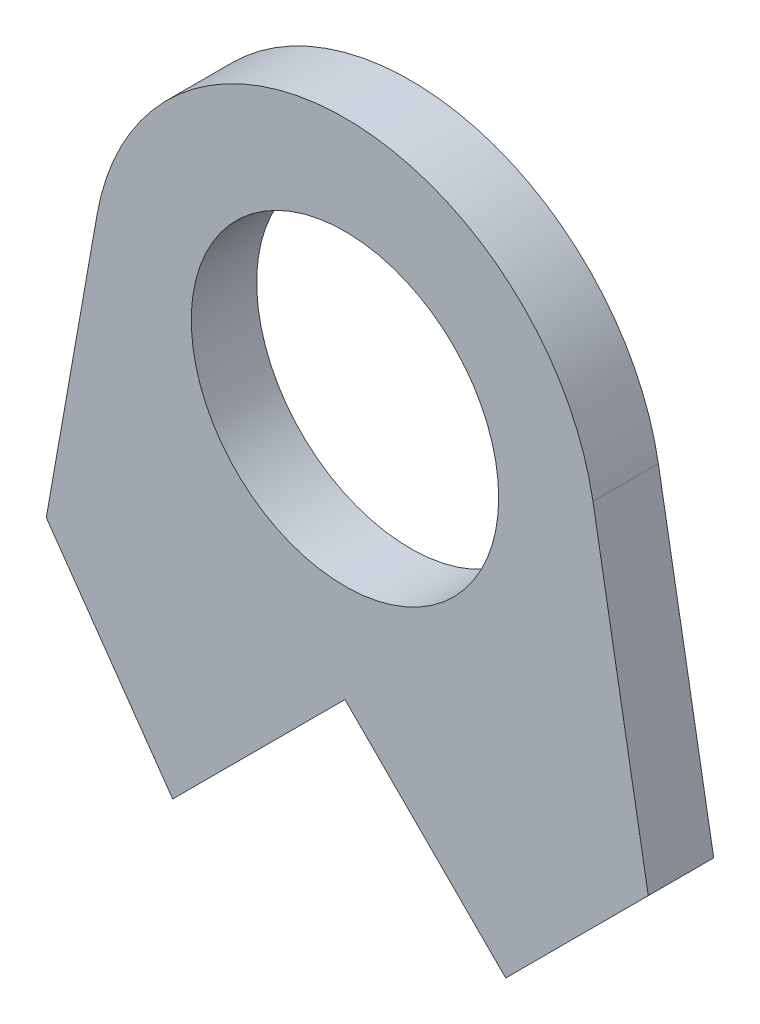
ISO-10303-21;
HEADER;
FILE_DESCRIPTION(('STEP AP214'),'2;1');
FILE_NAME('part.step','',(''),(''),'','','');
FILE_SCHEMA(('AUTOMOTIVE_DESIGN { 1 0 10303 214 1 1 1 1 }'));
ENDSEC;
DATA;
#1=APPLICATION_CONTEXT('core data for automotive mechanical design processes');
#2=APPLICATION_PROTOCOL_DEFINITION('international standard','automotive_design',2000,#1);
#3=PRODUCT_CONTEXT('',#1,'mechanical');
#4=PRODUCT('Part','Part','',(#3));
#5=PRODUCT_RELATED_PRODUCT_CATEGORY('part','',(#4));
#6=PRODUCT_DEFINITION_FORMATION('','',#4);
#7=PRODUCT_DEFINITION_CONTEXT('part definition',#1,'design');
#8=PRODUCT_DEFINITION('design','',#6,#7);
#9=PRODUCT_DEFINITION_SHAPE('','',#8);
#10=(LENGTH_UNIT() NAMED_UNIT(*) SI_UNIT(.MILLI.,.METRE.));
#11=(NAMED_UNIT(*) PLANE_ANGLE_UNIT() SI_UNIT($,.RADIAN.));
#12=(NAMED_UNIT(*) SI_UNIT($,.STERADIAN.) SOLID_ANGLE_UNIT());
#13=UNCERTAINTY_MEASURE_WITH_UNIT(LENGTH_MEASURE(1.E-05),#10,'distance_accuracy_value','');
#14=(GEOMETRIC_REPRESENTATION_CONTEXT(3) GLOBAL_UNCERTAINTY_ASSIGNED_CONTEXT((#13)) GLOBAL_UNIT_ASSIGNED_CONTEXT((#10,
#11,#12)) REPRESENTATION_CONTEXT('',''));
#15=CARTESIAN_POINT('',(0.,0.,0.));
#16=DIRECTION('',(0.,0.,1.));
#17=DIRECTION('',(1.,0.,0.));
#18=AXIS2_PLACEMENT_3D('',#15,#16,#17);
#19=CARTESIAN_POINT('',(85.,265.346291066469,10.));
#20=DIRECTION('',(0.,0.,-1.));
#21=DIRECTION('',(-1.,0.,0.));
#22=AXIS2_PLACEMENT_3D('',#19,#20,#21);
#23=PLANE('',#22);
#24=DIRECTION('',(-0.173648177666935,-0.984807753012207,0.));
#25=VECTOR('',#24,1.);
#26=CARTESIAN_POINT('',(47.08490150903,272.031745906646,10.));
#27=LINE('',#26,#25);
#28=CARTESIAN_POINT('',(47.08490150903,272.031745906646,10.));
#29=VERTEX_POINT('',#28);
#30=CARTESIAN_POINT('',(39.3396518645264,228.106252409373,10.));
#31=VERTEX_POINT('',#30);
#32=EDGE_CURVE('E116',#29,#31,#27,.T.);
#33=ORIENTED_EDGE('',*,*,#32,.T.);
#34=DIRECTION('',(-0.573576436351047,0.819152044288991,0.));
#35=VECTOR('',#34,1.);
#36=CARTESIAN_POINT('',(60.026746234922,198.562019819007,10.));
#37=LINE('',#36,#35);
#38=CARTESIAN_POINT('',(58.6631483516009,200.509439418069,10.));
#39=VERTEX_POINT('',#38);
#40=EDGE_CURVE('E147',#31,#39,#37,.F.);
#41=ORIENTED_EDGE('',*,*,#40,.T.);
#42=DIRECTION('',(0.707106781186547,0.707106781186548,0.));
#43=VECTOR('',#42,1.);
#44=CARTESIAN_POINT('',(85.,226.846291066469,10.));
#45=LINE('',#44,#43);
#46=CARTESIAN_POINT('',(85.,226.846291066469,10.));
#47=VERTEX_POINT('',#46);
#48=EDGE_CURVE('E118',#39,#47,#45,.T.);
#49=ORIENTED_EDGE('',*,*,#48,.T.);
#50=DIRECTION('',(0.707106781186549,-0.707106781186546,0.));
#51=VECTOR('',#50,1.);
#52=CARTESIAN_POINT('',(85.,226.846291066469,10.));
#53=LINE('',#52,#51);
#54=CARTESIAN_POINT('',(109.577032356472,202.269258709997,10.));
#55=VERTEX_POINT('',#54);
#56=EDGE_CURVE('E101',#47,#55,#53,.T.);
#57=ORIENTED_EDGE('',*,*,#56,.T.);
#58=DIRECTION('',(-0.707106781186544,-0.707106781186551,0.));
#59=VECTOR('',#58,1.);
#60=CARTESIAN_POINT('',(131.372906538627,224.065132892153,10.));
#61=LINE('',#60,#59);
#62=CARTESIAN_POINT('',(131.372906538627,224.065132892153,10.));
#63=VERTEX_POINT('',#62);
#64=EDGE_CURVE('E50',#55,#63,#61,.F.);
#65=ORIENTED_EDGE('',*,*,#64,.T.);
#66=DIRECTION('',(-0.173648177666935,0.984807753012207,0.));
#67=VECTOR('',#66,1.);
#68=CARTESIAN_POINT('',(122.91509849097,272.031745906646,10.));
#69=LINE('',#68,#67);
#70=CARTESIAN_POINT('',(122.91509849097,272.031745906646,10.));
#71=VERTEX_POINT('',#70);
#72=EDGE_CURVE('E91',#63,#71,#69,.T.);
#73=ORIENTED_EDGE('',*,*,#72,.T.);
#74=CARTESIAN_POINT('',(85.,265.346291066469,10.));
#75=DIRECTION('',(0.,0.,1.));
#76=DIRECTION('',(-1.,0.,0.));
#77=AXIS2_PLACEMENT_3D('',#74,#75,#76);
#78=CIRCLE('',#77,38.5);
#79=EDGE_CURVE('E96',#71,#29,#78,.T.);
#80=ORIENTED_EDGE('',*,*,#79,.T.);
#81=EDGE_LOOP('',(#33,#41,#49,#57,#65,#73,#80));
#82=FACE_BOUND('',#81,.T.);
#83=CARTESIAN_POINT('',(85.,265.346291066469,10.));
#84=DIRECTION('',(0.,0.,1.));
#85=DIRECTION('',(1.,0.,0.));
#86=AXIS2_PLACEMENT_3D('',#83,#84,#85);
#87=CIRCLE('',#86,23.4999999999999);
#88=CARTESIAN_POINT('',(108.5,265.346291066469,10.));
#89=VERTEX_POINT('',#88);
#90=EDGE_CURVE('E126',#89,#89,#87,.T.);
#91=ORIENTED_EDGE('',*,*,#90,.F.);
#92=EDGE_LOOP('',(#91));
#93=FACE_BOUND('',#92,.T.);
#94=ADVANCED_FACE('F35',(#82,#93),#23,.F.);
#95=CARTESIAN_POINT('',(85.,265.346291066469,0.));
#96=DIRECTION('',(0.,0.,-1.));
#97=DIRECTION('',(-1.,0.,0.));
#98=AXIS2_PLACEMENT_3D('',#95,#96,#97);
#99=PLANE('',#98);
#100=DIRECTION('',(0.707106781186547,0.707106781186548,0.));
#101=VECTOR('',#100,1.);
#102=CARTESIAN_POINT('',(85.,226.846291066469,0.));
#103=LINE('',#102,#101);
#104=CARTESIAN_POINT('',(58.6631483516009,200.509439418069,0.));
#105=VERTEX_POINT('',#104);
#106=CARTESIAN_POINT('',(85.,226.846291066469,0.));
#107=VERTEX_POINT('',#106);
#108=EDGE_CURVE('E133',#105,#107,#103,.T.);
#109=ORIENTED_EDGE('',*,*,#108,.F.);
#110=DIRECTION('',(0.573576436351047,-0.819152044288991,0.));
#111=VECTOR('',#110,1.);
#112=CARTESIAN_POINT('',(36.8643517635386,231.641347314687,0.));
#113=LINE('',#112,#111);
#114=CARTESIAN_POINT('',(39.3396518645264,228.106252409373,0.));
#115=VERTEX_POINT('',#114);
#116=EDGE_CURVE('E141',#105,#115,#113,.F.);
#117=ORIENTED_EDGE('',*,*,#116,.T.);
#118=DIRECTION('',(-0.173648177666935,-0.984807753012207,0.));
#119=VECTOR('',#118,1.);
#120=CARTESIAN_POINT('',(47.08490150903,272.031745906646,0.));
#121=LINE('',#120,#119);
#122=CARTESIAN_POINT('',(47.08490150903,272.031745906646,0.));
#123=VERTEX_POINT('',#122);
#124=EDGE_CURVE('E130',#123,#115,#121,.T.);
#125=ORIENTED_EDGE('',*,*,#124,.F.);
#126=CARTESIAN_POINT('',(85.,265.346291066469,0.));
#127=DIRECTION('',(0.,0.,1.));
#128=DIRECTION('',(-1.,0.,0.));
#129=AXIS2_PLACEMENT_3D('',#126,#127,#128);
#130=CIRCLE('',#129,38.5);
#131=CARTESIAN_POINT('',(122.91509849097,272.031745906646,0.));
#132=VERTEX_POINT('',#131);
#133=EDGE_CURVE('E128',#132,#123,#130,.T.);
#134=ORIENTED_EDGE('',*,*,#133,.F.);
#135=DIRECTION('',(-0.173648177666935,0.984807753012207,0.));
#136=VECTOR('',#135,1.);
#137=CARTESIAN_POINT('',(122.91509849097,272.031745906646,0.));
#138=LINE('',#137,#136);
#139=CARTESIAN_POINT('',(131.372906538627,224.065132892153,0.));
#140=VERTEX_POINT('',#139);
#141=EDGE_CURVE('E107',#140,#132,#138,.T.);
#142=ORIENTED_EDGE('',*,*,#141,.F.);
#143=DIRECTION('',(0.707106781186544,0.707106781186551,0.));
#144=VECTOR('',#143,1.);
#145=CARTESIAN_POINT('',(128.827032356472,221.519258709997,0.));
#146=LINE('',#145,#144);
#147=CARTESIAN_POINT('',(109.577032356472,202.269258709997,0.));
#148=VERTEX_POINT('',#147);
#149=EDGE_CURVE('E139',#140,#148,#146,.F.);
#150=ORIENTED_EDGE('',*,*,#149,.T.);
#151=DIRECTION('',(0.707106781186549,-0.707106781186546,0.));
#152=VECTOR('',#151,1.);
#153=CARTESIAN_POINT('',(85.,226.846291066469,0.));
#154=LINE('',#153,#152);
#155=EDGE_CURVE('E124',#107,#148,#154,.T.);
#156=ORIENTED_EDGE('',*,*,#155,.F.);
#157=EDGE_LOOP('',(#109,#117,#125,#134,#142,#150,#156));
#158=FACE_BOUND('',#157,.T.);
#159=CARTESIAN_POINT('',(85.,265.346291066469,0.));
#160=DIRECTION('',(0.,0.,1.));
#161=DIRECTION('',(1.,0.,0.));
#162=AXIS2_PLACEMENT_3D('',#159,#160,#161);
#163=CIRCLE('',#162,23.4999999999999);
#164=CARTESIAN_POINT('',(108.5,265.346291066469,0.));
#165=VERTEX_POINT('',#164);
#166=EDGE_CURVE('E168',#165,#165,#163,.T.);
#167=ORIENTED_EDGE('',*,*,#166,.T.);
#168=EDGE_LOOP('',(#167));
#169=FACE_BOUND('',#168,.T.);
#170=ADVANCED_FACE('F151',(#158,#169),#99,.T.);
#171=CARTESIAN_POINT('',(85.,226.846291066469,10.));
#172=DIRECTION('',(0.707106781186546,0.707106781186549,0.));
#173=DIRECTION('',(-0.707106781186549,0.707106781186546,0.));
#174=AXIS2_PLACEMENT_3D('',#171,#172,#173);
#175=PLANE('',#174);
#176=ORIENTED_EDGE('',*,*,#155,.T.);
#177=DIRECTION('',(0.,0.,-1.));
#178=VECTOR('',#177,1.);
#179=CARTESIAN_POINT('',(109.577032356472,202.269258709997,10.));
#180=LINE('',#179,#178);
#181=EDGE_CURVE('E11',#148,#55,#180,.F.);
#182=ORIENTED_EDGE('',*,*,#181,.T.);
#183=ORIENTED_EDGE('',*,*,#56,.F.);
#184=DIRECTION('',(0.,0.,-1.));
#185=VECTOR('',#184,1.);
#186=CARTESIAN_POINT('',(85.,226.846291066469,10.));
#187=LINE('',#186,#185);
#188=EDGE_CURVE('E123',#47,#107,#187,.T.);
#189=ORIENTED_EDGE('',*,*,#188,.T.);
#190=EDGE_LOOP('',(#176,#182,#183,#189));
#191=FACE_BOUND('',#190,.T.);
#192=ADVANCED_FACE('F166',(#191),#175,.F.);
#193=CARTESIAN_POINT('',(122.91509849097,272.031745906646,10.));
#194=DIRECTION('',(-0.984807753012207,-0.173648177666935,0.));
#195=DIRECTION('',(0.173648177666935,-0.984807753012207,0.));
#196=AXIS2_PLACEMENT_3D('',#193,#194,#195);
#197=PLANE('',#196);
#198=ORIENTED_EDGE('',*,*,#72,.F.);
#199=DIRECTION('',(0.,0.,-1.));
#200=VECTOR('',#199,1.);
#201=CARTESIAN_POINT('',(131.372906538627,224.065132892153,10.));
#202=LINE('',#201,#200);
#203=EDGE_CURVE('E43',#63,#140,#202,.T.);
#204=ORIENTED_EDGE('',*,*,#203,.T.);
#205=ORIENTED_EDGE('',*,*,#141,.T.);
#206=DIRECTION('',(0.,0.,-1.));
#207=VECTOR('',#206,1.);
#208=CARTESIAN_POINT('',(122.91509849097,272.031745906646,10.));
#209=LINE('',#208,#207);
#210=EDGE_CURVE('E104',#71,#132,#209,.T.);
#211=ORIENTED_EDGE('',*,*,#210,.F.);
#212=EDGE_LOOP('',(#198,#204,#205,#211));
#213=FACE_BOUND('',#212,.T.);
#214=ADVANCED_FACE('F105',(#213),#197,.F.);
#215=CARTESIAN_POINT('',(85.,265.346291066469,10.));
#216=DIRECTION('',(0.,0.,-1.));
#217=DIRECTION('',(-1.,0.,0.));
#218=AXIS2_PLACEMENT_3D('',#215,#216,#217);
#219=CYLINDRICAL_SURFACE('',#218,38.5);
#220=ORIENTED_EDGE('',*,*,#133,.T.);
#221=DIRECTION('',(0.,0.,-1.));
#222=VECTOR('',#221,1.);
#223=CARTESIAN_POINT('',(47.08490150903,272.031745906646,10.));
#224=LINE('',#223,#222);
#225=EDGE_CURVE('E111',#29,#123,#224,.T.);
#226=ORIENTED_EDGE('',*,*,#225,.F.);
#227=ORIENTED_EDGE('',*,*,#79,.F.);
#228=ORIENTED_EDGE('',*,*,#210,.T.);
#229=EDGE_LOOP('',(#220,#226,#227,#228));
#230=FACE_BOUND('',#229,.T.);
#231=ADVANCED_FACE('F113',(#230),#219,.T.);
#232=CARTESIAN_POINT('',(47.08490150903,272.031745906646,10.));
#233=DIRECTION('',(0.984807753012207,-0.173648177666935,0.));
#234=DIRECTION('',(0.173648177666935,0.984807753012207,0.));
#235=AXIS2_PLACEMENT_3D('',#232,#233,#234);
#236=PLANE('',#235);
#237=ORIENTED_EDGE('',*,*,#124,.T.);
#238=DIRECTION('',(0.,0.,1.));
#239=VECTOR('',#238,1.);
#240=CARTESIAN_POINT('',(39.3396518645264,228.106252409373,10.));
#241=LINE('',#240,#239);
#242=EDGE_CURVE('E143',#115,#31,#241,.T.);
#243=ORIENTED_EDGE('',*,*,#242,.T.);
#244=ORIENTED_EDGE('',*,*,#32,.F.);
#245=ORIENTED_EDGE('',*,*,#225,.T.);
#246=EDGE_LOOP('',(#237,#243,#244,#245));
#247=FACE_BOUND('',#246,.T.);
#248=ADVANCED_FACE('F156',(#247),#236,.F.);
#249=CARTESIAN_POINT('',(85.,226.846291066469,10.));
#250=DIRECTION('',(-0.707106781186548,0.707106781186547,0.));
#251=DIRECTION('',(-0.707106781186547,-0.707106781186548,0.));
#252=AXIS2_PLACEMENT_3D('',#249,#250,#251);
#253=PLANE('',#252);
#254=ORIENTED_EDGE('',*,*,#48,.F.);
#255=DIRECTION('',(0.,0.,1.));
#256=VECTOR('',#255,1.);
#257=CARTESIAN_POINT('',(58.6631483516009,200.509439418069,10.));
#258=LINE('',#257,#256);
#259=EDGE_CURVE('E110',#39,#105,#258,.F.);
#260=ORIENTED_EDGE('',*,*,#259,.T.);
#261=ORIENTED_EDGE('',*,*,#108,.T.);
#262=ORIENTED_EDGE('',*,*,#188,.F.);
#263=EDGE_LOOP('',(#254,#260,#261,#262));
#264=FACE_BOUND('',#263,.T.);
#265=ADVANCED_FACE('F163',(#264),#253,.F.);
#266=CARTESIAN_POINT('',(85.,265.346291066469,10.));
#267=DIRECTION('',(0.,0.,-1.));
#268=DIRECTION('',(-1.,0.,0.));
#269=AXIS2_PLACEMENT_3D('',#266,#267,#268);
#270=CYLINDRICAL_SURFACE('',#269,23.4999999999999);
#271=ORIENTED_EDGE('',*,*,#90,.T.);
#272=EDGE_LOOP('',(#271));
#273=FACE_BOUND('',#272,.T.);
#274=ORIENTED_EDGE('',*,*,#166,.F.);
#275=EDGE_LOOP('',(#274));
#276=FACE_BOUND('',#275,.T.);
#277=ADVANCED_FACE('F174',(#273,#276),#270,.F.);
#278=CARTESIAN_POINT('',(60.026746234922,198.562019819007,10.));
#279=DIRECTION('',(0.819152044288991,0.573576436351047,0.));
#280=DIRECTION('',(0.,0.,-1.));
#281=AXIS2_PLACEMENT_3D('',#278,#279,#280);
#282=PLANE('',#281);
#283=ORIENTED_EDGE('',*,*,#40,.F.);
#284=ORIENTED_EDGE('',*,*,#242,.F.);
#285=ORIENTED_EDGE('',*,*,#116,.F.);
#286=ORIENTED_EDGE('',*,*,#259,.F.);
#287=EDGE_LOOP('',(#283,#284,#285,#286));
#288=FACE_BOUND('',#287,.T.);
#289=ADVANCED_FACE('F165',(#288),#282,.F.);
#290=CARTESIAN_POINT('',(131.372906538627,224.065132892153,10.));
#291=DIRECTION('',(-0.707106781186551,0.707106781186544,0.));
#292=DIRECTION('',(0.,0.,-1.));
#293=AXIS2_PLACEMENT_3D('',#290,#291,#292);
#294=PLANE('',#293);
#295=ORIENTED_EDGE('',*,*,#64,.F.);
#296=ORIENTED_EDGE('',*,*,#181,.F.);
#297=ORIENTED_EDGE('',*,*,#149,.F.);
#298=ORIENTED_EDGE('',*,*,#203,.F.);
#299=EDGE_LOOP('',(#295,#296,#297,#298));
#300=FACE_BOUND('',#299,.T.);
#301=ADVANCED_FACE('F37',(#300),#294,.F.);
#302=CLOSED_SHELL('',(#94,#170,#192,#214,#231,#248,#265,#277,#289,#301));
#303=MANIFOLD_SOLID_BREP('B2',#302);
#304=ADVANCED_BREP_SHAPE_REPRESENTATION('',(#18,#303),#14);
#305=SHAPE_DEFINITION_REPRESENTATION(#9,#304);
ENDSEC;
END-ISO-10303-21;
